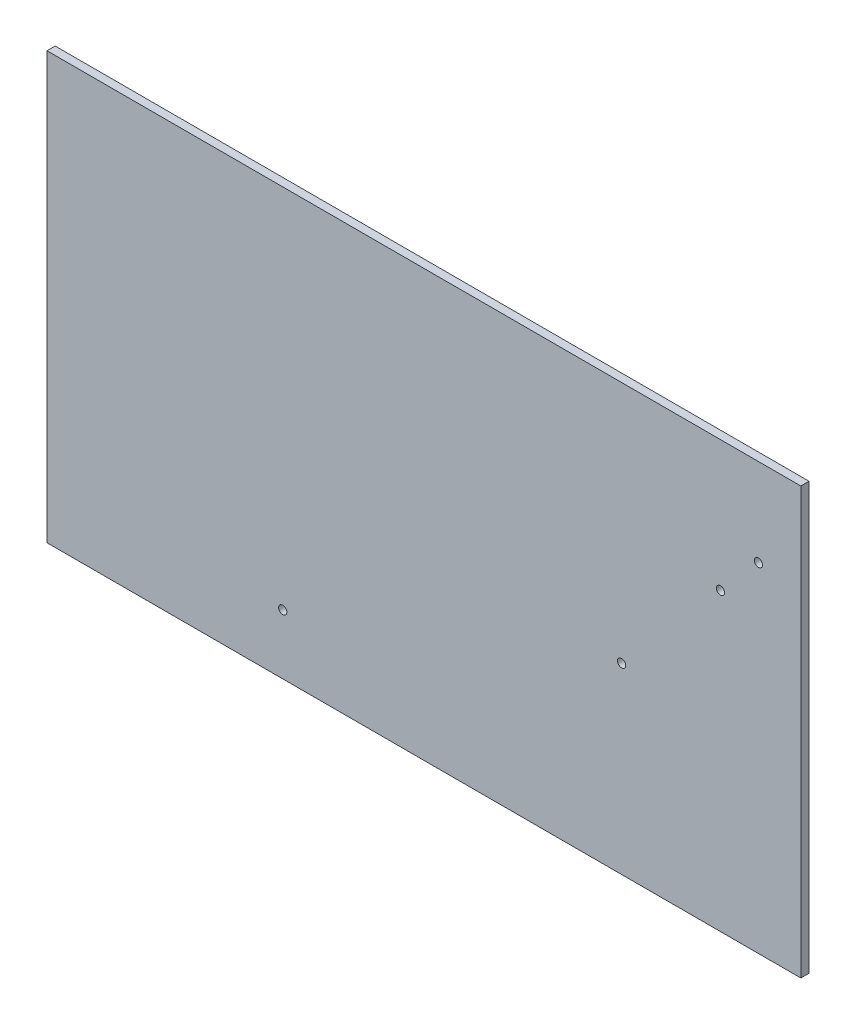
ISO-10303-21;
HEADER;
FILE_DESCRIPTION(('STEP AP214'),'2;1');
FILE_NAME('part.step','',(''),(''),'','','');
FILE_SCHEMA(('AUTOMOTIVE_DESIGN { 1 0 10303 214 1 1 1 1 }'));
ENDSEC;
DATA;
#1=APPLICATION_CONTEXT('core data for automotive mechanical design processes');
#2=APPLICATION_PROTOCOL_DEFINITION('international standard','automotive_design',2000,#1);
#3=PRODUCT_CONTEXT('',#1,'mechanical');
#4=PRODUCT('Part','Part','',(#3));
#5=PRODUCT_RELATED_PRODUCT_CATEGORY('part','',(#4));
#6=PRODUCT_DEFINITION_FORMATION('','',#4);
#7=PRODUCT_DEFINITION_CONTEXT('part definition',#1,'design');
#8=PRODUCT_DEFINITION('design','',#6,#7);
#9=PRODUCT_DEFINITION_SHAPE('','',#8);
#10=(LENGTH_UNIT() NAMED_UNIT(*) SI_UNIT(.MILLI.,.METRE.));
#11=(NAMED_UNIT(*) PLANE_ANGLE_UNIT() SI_UNIT($,.RADIAN.));
#12=(NAMED_UNIT(*) SI_UNIT($,.STERADIAN.) SOLID_ANGLE_UNIT());
#13=UNCERTAINTY_MEASURE_WITH_UNIT(LENGTH_MEASURE(1.E-05),#10,'distance_accuracy_value','');
#14=(GEOMETRIC_REPRESENTATION_CONTEXT(3) GLOBAL_UNCERTAINTY_ASSIGNED_CONTEXT((#13)) GLOBAL_UNIT_ASSIGNED_CONTEXT((#10,
#11,#12)) REPRESENTATION_CONTEXT('',''));
#15=CARTESIAN_POINT('',(0.,0.,0.));
#16=DIRECTION('',(0.,0.,1.));
#17=DIRECTION('',(1.,0.,0.));
#18=AXIS2_PLACEMENT_3D('',#15,#16,#17);
#19=CARTESIAN_POINT('',(0.,0.,6.35));
#20=DIRECTION('',(0.,0.,-1.));
#21=DIRECTION('',(-1.,0.,0.));
#22=AXIS2_PLACEMENT_3D('',#19,#20,#21);
#23=PLANE('',#22);
#24=DIRECTION('',(0.,1.,0.));
#25=VECTOR('',#24,1.);
#26=CARTESIAN_POINT('',(584.2,0.,6.35));
#27=LINE('',#26,#25);
#28=CARTESIAN_POINT('',(584.2,0.,6.35));
#29=VERTEX_POINT('',#28);
#30=CARTESIAN_POINT('',(584.2,330.2,6.35));
#31=VERTEX_POINT('',#30);
#32=EDGE_CURVE('E84',#29,#31,#27,.T.);
#33=ORIENTED_EDGE('',*,*,#32,.T.);
#34=DIRECTION('',(-1.,0.,0.));
#35=VECTOR('',#34,1.);
#36=CARTESIAN_POINT('',(0.,330.2,6.35));
#37=LINE('',#36,#35);
#38=CARTESIAN_POINT('',(0.,330.2,6.35));
#39=VERTEX_POINT('',#38);
#40=EDGE_CURVE('E79',#31,#39,#37,.T.);
#41=ORIENTED_EDGE('',*,*,#40,.T.);
#42=DIRECTION('',(0.,-1.,0.));
#43=VECTOR('',#42,1.);
#44=CARTESIAN_POINT('',(0.,0.,6.35));
#45=LINE('',#44,#43);
#46=CARTESIAN_POINT('',(0.,0.,6.35));
#47=VERTEX_POINT('',#46);
#48=EDGE_CURVE('E82',#39,#47,#45,.T.);
#49=ORIENTED_EDGE('',*,*,#48,.T.);
#50=DIRECTION('',(1.,0.,0.));
#51=VECTOR('',#50,1.);
#52=CARTESIAN_POINT('',(0.,0.,6.35));
#53=LINE('',#52,#51);
#54=EDGE_CURVE('E49',#47,#29,#53,.T.);
#55=ORIENTED_EDGE('',*,*,#54,.T.);
#56=EDGE_LOOP('',(#33,#41,#49,#55));
#57=FACE_BOUND('',#56,.T.);
#58=CARTESIAN_POINT('',(182.717550730803,46.2771949574764,6.35));
#59=DIRECTION('',(0.,0.,1.));
#60=DIRECTION('',(1.,0.,0.));
#61=AXIS2_PLACEMENT_3D('',#58,#59,#60);
#62=CIRCLE('',#61,3.175);
#63=CARTESIAN_POINT('',(185.892550730803,46.2771949574764,6.35));
#64=VERTEX_POINT('',#63);
#65=EDGE_CURVE('E99',#64,#64,#62,.T.);
#66=ORIENTED_EDGE('',*,*,#65,.F.);
#67=EDGE_LOOP('',(#66));
#68=FACE_BOUND('',#67,.T.);
#69=CARTESIAN_POINT('',(445.267668978386,141.837623002669,6.35));
#70=DIRECTION('',(0.,0.,1.));
#71=DIRECTION('',(1.,0.,0.));
#72=AXIS2_PLACEMENT_3D('',#69,#70,#71);
#73=CIRCLE('',#72,3.17499999999997);
#74=CARTESIAN_POINT('',(448.442668978386,141.837623002669,6.35));
#75=VERTEX_POINT('',#74);
#76=EDGE_CURVE('E114',#75,#75,#73,.T.);
#77=ORIENTED_EDGE('',*,*,#76,.F.);
#78=EDGE_LOOP('',(#77));
#79=FACE_BOUND('',#78,.T.);
#80=CARTESIAN_POINT('',(521.93327346028,228.950470163816,6.35));
#81=DIRECTION('',(0.,0.,1.));
#82=DIRECTION('',(1.,0.,0.));
#83=AXIS2_PLACEMENT_3D('',#80,#81,#82);
#84=CIRCLE('',#83,3.17500000000009);
#85=CARTESIAN_POINT('',(525.10827346028,228.950470163816,6.35));
#86=VERTEX_POINT('',#85);
#87=EDGE_CURVE('E120',#86,#86,#84,.T.);
#88=ORIENTED_EDGE('',*,*,#87,.F.);
#89=EDGE_LOOP('',(#88));
#90=FACE_BOUND('',#89,.T.);
#91=CARTESIAN_POINT('',(551.299543138451,262.318489361679,6.35));
#92=DIRECTION('',(0.,0.,1.));
#93=DIRECTION('',(1.,0.,0.));
#94=AXIS2_PLACEMENT_3D('',#91,#92,#93);
#95=CIRCLE('',#94,3.17500000000008);
#96=CARTESIAN_POINT('',(554.474543138452,262.318489361679,6.35));
#97=VERTEX_POINT('',#96);
#98=EDGE_CURVE('E126',#97,#97,#95,.T.);
#99=ORIENTED_EDGE('',*,*,#98,.F.);
#100=EDGE_LOOP('',(#99));
#101=FACE_BOUND('',#100,.T.);
#102=ADVANCED_FACE('F32',(#57,#68,#79,#90,#101),#23,.F.);
#103=CARTESIAN_POINT('',(0.,0.,0.));
#104=DIRECTION('',(0.,0.,-1.));
#105=DIRECTION('',(-1.,0.,0.));
#106=AXIS2_PLACEMENT_3D('',#103,#104,#105);
#107=PLANE('',#106);
#108=CARTESIAN_POINT('',(521.93327346028,228.950470163816,0.));
#109=DIRECTION('',(0.,0.,1.));
#110=DIRECTION('',(1.,0.,0.));
#111=AXIS2_PLACEMENT_3D('',#108,#109,#110);
#112=CIRCLE('',#111,3.17500000000009);
#113=CARTESIAN_POINT('',(525.10827346028,228.950470163816,0.));
#114=VERTEX_POINT('',#113);
#115=EDGE_CURVE('E123',#114,#114,#112,.T.);
#116=ORIENTED_EDGE('',*,*,#115,.T.);
#117=EDGE_LOOP('',(#116));
#118=FACE_BOUND('',#117,.T.);
#119=CARTESIAN_POINT('',(182.717550730803,46.2771949574764,0.));
#120=DIRECTION('',(0.,0.,1.));
#121=DIRECTION('',(1.,0.,0.));
#122=AXIS2_PLACEMENT_3D('',#119,#120,#121);
#123=CIRCLE('',#122,3.175);
#124=CARTESIAN_POINT('',(185.892550730803,46.2771949574764,0.));
#125=VERTEX_POINT('',#124);
#126=EDGE_CURVE('E111',#125,#125,#123,.T.);
#127=ORIENTED_EDGE('',*,*,#126,.T.);
#128=EDGE_LOOP('',(#127));
#129=FACE_BOUND('',#128,.T.);
#130=DIRECTION('',(0.,1.,0.));
#131=VECTOR('',#130,1.);
#132=CARTESIAN_POINT('',(584.2,0.,0.));
#133=LINE('',#132,#131);
#134=CARTESIAN_POINT('',(584.2,0.,0.));
#135=VERTEX_POINT('',#134);
#136=CARTESIAN_POINT('',(584.2,330.2,0.));
#137=VERTEX_POINT('',#136);
#138=EDGE_CURVE('E96',#135,#137,#133,.T.);
#139=ORIENTED_EDGE('',*,*,#138,.F.);
#140=DIRECTION('',(1.,0.,0.));
#141=VECTOR('',#140,1.);
#142=CARTESIAN_POINT('',(0.,0.,0.));
#143=LINE('',#142,#141);
#144=CARTESIAN_POINT('',(0.,0.,0.));
#145=VERTEX_POINT('',#144);
#146=EDGE_CURVE('E72',#145,#135,#143,.T.);
#147=ORIENTED_EDGE('',*,*,#146,.F.);
#148=DIRECTION('',(0.,-1.,0.));
#149=VECTOR('',#148,1.);
#150=CARTESIAN_POINT('',(0.,0.,0.));
#151=LINE('',#150,#149);
#152=CARTESIAN_POINT('',(0.,330.2,0.));
#153=VERTEX_POINT('',#152);
#154=EDGE_CURVE('E66',#153,#145,#151,.T.);
#155=ORIENTED_EDGE('',*,*,#154,.F.);
#156=DIRECTION('',(-1.,0.,0.));
#157=VECTOR('',#156,1.);
#158=CARTESIAN_POINT('',(0.,330.2,0.));
#159=LINE('',#158,#157);
#160=EDGE_CURVE('E88',#137,#153,#159,.T.);
#161=ORIENTED_EDGE('',*,*,#160,.F.);
#162=EDGE_LOOP('',(#139,#147,#155,#161));
#163=FACE_BOUND('',#162,.T.);
#164=CARTESIAN_POINT('',(445.267668978386,141.837623002669,0.));
#165=DIRECTION('',(0.,0.,1.));
#166=DIRECTION('',(1.,0.,0.));
#167=AXIS2_PLACEMENT_3D('',#164,#165,#166);
#168=CIRCLE('',#167,3.17499999999997);
#169=CARTESIAN_POINT('',(448.442668978386,141.837623002669,0.));
#170=VERTEX_POINT('',#169);
#171=EDGE_CURVE('E117',#170,#170,#168,.T.);
#172=ORIENTED_EDGE('',*,*,#171,.T.);
#173=EDGE_LOOP('',(#172));
#174=FACE_BOUND('',#173,.T.);
#175=CARTESIAN_POINT('',(551.299543138451,262.318489361679,0.));
#176=DIRECTION('',(0.,0.,1.));
#177=DIRECTION('',(1.,0.,0.));
#178=AXIS2_PLACEMENT_3D('',#175,#176,#177);
#179=CIRCLE('',#178,3.17500000000008);
#180=CARTESIAN_POINT('',(554.474543138452,262.318489361679,0.));
#181=VERTEX_POINT('',#180);
#182=EDGE_CURVE('E129',#181,#181,#179,.T.);
#183=ORIENTED_EDGE('',*,*,#182,.T.);
#184=EDGE_LOOP('',(#183));
#185=FACE_BOUND('',#184,.T.);
#186=ADVANCED_FACE('F107',(#118,#129,#163,#174,#185),#107,.T.);
#187=CARTESIAN_POINT('',(584.2,0.,6.35));
#188=DIRECTION('',(-1.,0.,0.));
#189=DIRECTION('',(0.,0.,1.));
#190=AXIS2_PLACEMENT_3D('',#187,#188,#189);
#191=PLANE('',#190);
#192=ORIENTED_EDGE('',*,*,#138,.T.);
#193=DIRECTION('',(0.,0.,-1.));
#194=VECTOR('',#193,1.);
#195=CARTESIAN_POINT('',(584.2,330.2,6.35));
#196=LINE('',#195,#194);
#197=EDGE_CURVE('E11',#31,#137,#196,.T.);
#198=ORIENTED_EDGE('',*,*,#197,.F.);
#199=ORIENTED_EDGE('',*,*,#32,.F.);
#200=DIRECTION('',(0.,0.,-1.));
#201=VECTOR('',#200,1.);
#202=CARTESIAN_POINT('',(584.2,0.,6.35));
#203=LINE('',#202,#201);
#204=EDGE_CURVE('E92',#29,#135,#203,.T.);
#205=ORIENTED_EDGE('',*,*,#204,.T.);
#206=EDGE_LOOP('',(#192,#198,#199,#205));
#207=FACE_BOUND('',#206,.T.);
#208=ADVANCED_FACE('F34',(#207),#191,.F.);
#209=CARTESIAN_POINT('',(0.,330.2,6.35));
#210=DIRECTION('',(0.,-1.,0.));
#211=DIRECTION('',(0.,0.,-1.));
#212=AXIS2_PLACEMENT_3D('',#209,#210,#211);
#213=PLANE('',#212);
#214=ORIENTED_EDGE('',*,*,#160,.T.);
#215=DIRECTION('',(0.,0.,-1.));
#216=VECTOR('',#215,1.);
#217=CARTESIAN_POINT('',(0.,330.2,6.35));
#218=LINE('',#217,#216);
#219=EDGE_CURVE('E41',#39,#153,#218,.T.);
#220=ORIENTED_EDGE('',*,*,#219,.F.);
#221=ORIENTED_EDGE('',*,*,#40,.F.);
#222=ORIENTED_EDGE('',*,*,#197,.T.);
#223=EDGE_LOOP('',(#214,#220,#221,#222));
#224=FACE_BOUND('',#223,.T.);
#225=ADVANCED_FACE('F87',(#224),#213,.F.);
#226=CARTESIAN_POINT('',(0.,0.,6.35));
#227=DIRECTION('',(1.,0.,0.));
#228=DIRECTION('',(0.,0.,-1.));
#229=AXIS2_PLACEMENT_3D('',#226,#227,#228);
#230=PLANE('',#229);
#231=ORIENTED_EDGE('',*,*,#154,.T.);
#232=DIRECTION('',(0.,0.,-1.));
#233=VECTOR('',#232,1.);
#234=CARTESIAN_POINT('',(0.,0.,6.35));
#235=LINE('',#234,#233);
#236=EDGE_CURVE('E89',#47,#145,#235,.T.);
#237=ORIENTED_EDGE('',*,*,#236,.F.);
#238=ORIENTED_EDGE('',*,*,#48,.F.);
#239=ORIENTED_EDGE('',*,*,#219,.T.);
#240=EDGE_LOOP('',(#231,#237,#238,#239));
#241=FACE_BOUND('',#240,.T.);
#242=ADVANCED_FACE('F90',(#241),#230,.F.);
#243=CARTESIAN_POINT('',(0.,0.,6.35));
#244=DIRECTION('',(0.,1.,0.));
#245=DIRECTION('',(0.,0.,1.));
#246=AXIS2_PLACEMENT_3D('',#243,#244,#245);
#247=PLANE('',#246);
#248=ORIENTED_EDGE('',*,*,#146,.T.);
#249=ORIENTED_EDGE('',*,*,#204,.F.);
#250=ORIENTED_EDGE('',*,*,#54,.F.);
#251=ORIENTED_EDGE('',*,*,#236,.T.);
#252=EDGE_LOOP('',(#248,#249,#250,#251));
#253=FACE_BOUND('',#252,.T.);
#254=ADVANCED_FACE('F104',(#253),#247,.F.);
#255=CARTESIAN_POINT('',(182.717550730803,46.2771949574764,6.35));
#256=DIRECTION('',(0.,0.,-1.));
#257=DIRECTION('',(-1.,0.,0.));
#258=AXIS2_PLACEMENT_3D('',#255,#256,#257);
#259=CYLINDRICAL_SURFACE('',#258,3.175);
#260=ORIENTED_EDGE('',*,*,#65,.T.);
#261=EDGE_LOOP('',(#260));
#262=FACE_BOUND('',#261,.T.);
#263=ORIENTED_EDGE('',*,*,#126,.F.);
#264=EDGE_LOOP('',(#263));
#265=FACE_BOUND('',#264,.T.);
#266=ADVANCED_FACE('F146',(#262,#265),#259,.F.);
#267=CARTESIAN_POINT('',(445.267668978386,141.837623002669,6.35));
#268=DIRECTION('',(0.,0.,-1.));
#269=DIRECTION('',(-1.,0.,0.));
#270=AXIS2_PLACEMENT_3D('',#267,#268,#269);
#271=CYLINDRICAL_SURFACE('',#270,3.17499999999997);
#272=ORIENTED_EDGE('',*,*,#76,.T.);
#273=EDGE_LOOP('',(#272));
#274=FACE_BOUND('',#273,.T.);
#275=ORIENTED_EDGE('',*,*,#171,.F.);
#276=EDGE_LOOP('',(#275));
#277=FACE_BOUND('',#276,.T.);
#278=ADVANCED_FACE('F192',(#274,#277),#271,.F.);
#279=CARTESIAN_POINT('',(521.93327346028,228.950470163816,6.35));
#280=DIRECTION('',(0.,0.,-1.));
#281=DIRECTION('',(-1.,0.,0.));
#282=AXIS2_PLACEMENT_3D('',#279,#280,#281);
#283=CYLINDRICAL_SURFACE('',#282,3.17500000000009);
#284=ORIENTED_EDGE('',*,*,#87,.T.);
#285=EDGE_LOOP('',(#284));
#286=FACE_BOUND('',#285,.T.);
#287=ORIENTED_EDGE('',*,*,#115,.F.);
#288=EDGE_LOOP('',(#287));
#289=FACE_BOUND('',#288,.T.);
#290=ADVANCED_FACE('F200',(#286,#289),#283,.F.);
#291=CARTESIAN_POINT('',(551.299543138451,262.318489361679,6.35));
#292=DIRECTION('',(0.,0.,-1.));
#293=DIRECTION('',(-1.,0.,0.));
#294=AXIS2_PLACEMENT_3D('',#291,#292,#293);
#295=CYLINDRICAL_SURFACE('',#294,3.17500000000008);
#296=ORIENTED_EDGE('',*,*,#98,.T.);
#297=EDGE_LOOP('',(#296));
#298=FACE_BOUND('',#297,.T.);
#299=ORIENTED_EDGE('',*,*,#182,.F.);
#300=EDGE_LOOP('',(#299));
#301=FACE_BOUND('',#300,.T.);
#302=ADVANCED_FACE('F135',(#298,#301),#295,.F.);
#303=CLOSED_SHELL('',(#102,#186,#208,#225,#242,#254,#266,#278,#290,#302));
#304=MANIFOLD_SOLID_BREP('B2',#303);
#305=ADVANCED_BREP_SHAPE_REPRESENTATION('',(#18,#304),#14);
#306=SHAPE_DEFINITION_REPRESENTATION(#9,#305);
ENDSEC;
END-ISO-10303-21;
